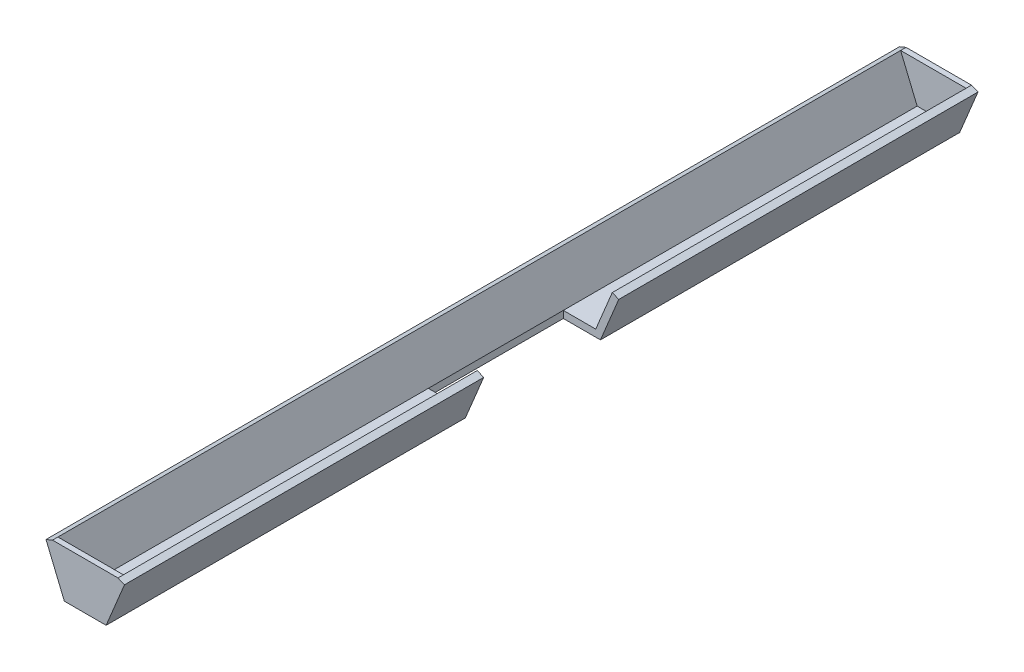
ISO-10303-21;
HEADER;
FILE_DESCRIPTION(('STEP AP214'),'2;1');
FILE_NAME('part.step','',(''),(''),'','','');
FILE_SCHEMA(('AUTOMOTIVE_DESIGN { 1 0 10303 214 1 1 1 1 }'));
ENDSEC;
DATA;
#1=APPLICATION_CONTEXT('core data for automotive mechanical design processes');
#2=APPLICATION_PROTOCOL_DEFINITION('international standard','automotive_design',2000,#1);
#3=PRODUCT_CONTEXT('',#1,'mechanical');
#4=PRODUCT('Part','Part','',(#3));
#5=PRODUCT_RELATED_PRODUCT_CATEGORY('part','',(#4));
#6=PRODUCT_DEFINITION_FORMATION('','',#4);
#7=PRODUCT_DEFINITION_CONTEXT('part definition',#1,'design');
#8=PRODUCT_DEFINITION('design','',#6,#7);
#9=PRODUCT_DEFINITION_SHAPE('','',#8);
#10=(LENGTH_UNIT() NAMED_UNIT(*) SI_UNIT(.MILLI.,.METRE.));
#11=(NAMED_UNIT(*) PLANE_ANGLE_UNIT() SI_UNIT($,.RADIAN.));
#12=(NAMED_UNIT(*) SI_UNIT($,.STERADIAN.) SOLID_ANGLE_UNIT());
#13=UNCERTAINTY_MEASURE_WITH_UNIT(LENGTH_MEASURE(1.E-05),#10,'distance_accuracy_value','');
#14=(GEOMETRIC_REPRESENTATION_CONTEXT(3) GLOBAL_UNCERTAINTY_ASSIGNED_CONTEXT((#13)) GLOBAL_UNIT_ASSIGNED_CONTEXT((#10,
#11,#12)) REPRESENTATION_CONTEXT('',''));
#15=CARTESIAN_POINT('',(0.,0.,0.));
#16=DIRECTION('',(0.,0.,1.));
#17=DIRECTION('',(1.,0.,0.));
#18=AXIS2_PLACEMENT_3D('',#15,#16,#17);
#19=CARTESIAN_POINT('',(3.,0.,79.));
#20=DIRECTION('',(0.923879532511287,-0.38268343236509,0.));
#21=DIRECTION('',(0.38268343236509,0.923879532511287,0.));
#22=AXIS2_PLACEMENT_3D('',#19,#20,#21);
#23=PLANE('',#22);
#24=DIRECTION('',(0.,0.,-1.));
#25=VECTOR('',#24,1.);
#26=CARTESIAN_POINT('',(6.06146745892072,7.39103626009029,79.));
#27=LINE('',#26,#25);
#28=CARTESIAN_POINT('',(6.06146745892072,7.39103626009029,78.));
#29=VERTEX_POINT('',#28);
#30=CARTESIAN_POINT('',(6.06146745892073,7.39103626009029,12.5));
#31=VERTEX_POINT('',#30);
#32=EDGE_CURVE('E253',#29,#31,#27,.T.);
#33=ORIENTED_EDGE('',*,*,#32,.T.);
#34=DIRECTION('',(-0.38268343236509,-0.923879532511287,0.));
#35=VECTOR('',#34,1.);
#36=CARTESIAN_POINT('',(3.,0.,12.5));
#37=LINE('',#36,#35);
#38=CARTESIAN_POINT('',(3.,0.,12.5));
#39=VERTEX_POINT('',#38);
#40=EDGE_CURVE('E185',#31,#39,#37,.T.);
#41=ORIENTED_EDGE('',*,*,#40,.T.);
#42=DIRECTION('',(0.,0.,-1.));
#43=VECTOR('',#42,1.);
#44=CARTESIAN_POINT('',(3.,0.,79.));
#45=LINE('',#44,#43);
#46=CARTESIAN_POINT('',(3.,0.,78.));
#47=VERTEX_POINT('',#46);
#48=EDGE_CURVE('E273',#47,#39,#45,.T.);
#49=ORIENTED_EDGE('',*,*,#48,.F.);
#50=DIRECTION('',(-0.38268343236509,-0.923879532511287,0.));
#51=VECTOR('',#50,1.);
#52=CARTESIAN_POINT('',(3.,0.,78.));
#53=LINE('',#52,#51);
#54=EDGE_CURVE('E201',#29,#47,#53,.T.);
#55=ORIENTED_EDGE('',*,*,#54,.F.);
#56=EDGE_LOOP('',(#33,#41,#49,#55));
#57=FACE_BOUND('',#56,.T.);
#58=ADVANCED_FACE('F33',(#57),#23,.F.);
#59=CARTESIAN_POINT('',(-3.,0.,79.));
#60=DIRECTION('',(0.,-1.,0.));
#61=DIRECTION('',(0.,0.,-1.));
#62=AXIS2_PLACEMENT_3D('',#59,#60,#61);
#63=PLANE('',#62);
#64=ORIENTED_EDGE('',*,*,#48,.T.);
#65=DIRECTION('',(-1.,0.,0.));
#66=VECTOR('',#65,1.);
#67=CARTESIAN_POINT('',(-3.00000000000001,0.,12.5));
#68=LINE('',#67,#66);
#69=CARTESIAN_POINT('',(-3.,0.,12.5));
#70=VERTEX_POINT('',#69);
#71=EDGE_CURVE('E188',#39,#70,#68,.T.);
#72=ORIENTED_EDGE('',*,*,#71,.T.);
#73=DIRECTION('',(0.,0.,-1.));
#74=VECTOR('',#73,1.);
#75=CARTESIAN_POINT('',(-3.,0.,79.));
#76=LINE('',#75,#74);
#77=CARTESIAN_POINT('',(-3.,0.,78.));
#78=VERTEX_POINT('',#77);
#79=EDGE_CURVE('E269',#78,#70,#76,.T.);
#80=ORIENTED_EDGE('',*,*,#79,.F.);
#81=DIRECTION('',(-1.,0.,0.));
#82=VECTOR('',#81,1.);
#83=CARTESIAN_POINT('',(-3.,0.,78.));
#84=LINE('',#83,#82);
#85=EDGE_CURVE('E56',#47,#78,#84,.T.);
#86=ORIENTED_EDGE('',*,*,#85,.F.);
#87=EDGE_LOOP('',(#64,#72,#80,#86));
#88=FACE_BOUND('',#87,.T.);
#89=ADVANCED_FACE('F337',(#88),#63,.F.);
#90=CARTESIAN_POINT('',(3.86863222929509,-1.3,79.));
#91=DIRECTION('',(-0.923879532511286,0.382683432365091,0.));
#92=DIRECTION('',(-0.382683432365091,-0.923879532511286,0.));
#93=AXIS2_PLACEMENT_3D('',#90,#91,#92);
#94=PLANE('',#93);
#95=DIRECTION('',(0.,0.,-1.));
#96=VECTOR('',#95,1.);
#97=CARTESIAN_POINT('',(3.86863222929509,-1.3,79.));
#98=LINE('',#97,#96);
#99=CARTESIAN_POINT('',(3.86863222929509,-1.3,79.));
#100=VERTEX_POINT('',#99);
#101=CARTESIAN_POINT('',(3.86863222929509,-1.3,12.5));
#102=VERTEX_POINT('',#101);
#103=EDGE_CURVE('E258',#100,#102,#98,.T.);
#104=ORIENTED_EDGE('',*,*,#103,.T.);
#105=DIRECTION('',(0.382683432365091,0.923879532511286,0.));
#106=VECTOR('',#105,1.);
#107=CARTESIAN_POINT('',(3.86863222929509,-1.3,12.5));
#108=LINE('',#107,#106);
#109=CARTESIAN_POINT('',(7.2625108511854,6.89354779801567,12.5));
#110=VERTEX_POINT('',#109);
#111=EDGE_CURVE('E166',#102,#110,#108,.T.);
#112=ORIENTED_EDGE('',*,*,#111,.T.);
#113=DIRECTION('',(0.,0.,-1.));
#114=VECTOR('',#113,1.);
#115=CARTESIAN_POINT('',(7.2625108511854,6.89354779801567,79.));
#116=LINE('',#115,#114);
#117=CARTESIAN_POINT('',(7.2625108511854,6.89354779801567,79.));
#118=VERTEX_POINT('',#117);
#119=EDGE_CURVE('E254',#118,#110,#116,.T.);
#120=ORIENTED_EDGE('',*,*,#119,.F.);
#121=DIRECTION('',(0.382683432365091,0.923879532511286,0.));
#122=VECTOR('',#121,1.);
#123=CARTESIAN_POINT('',(3.86863222929509,-1.3,79.));
#124=LINE('',#123,#122);
#125=EDGE_CURVE('E232',#100,#118,#124,.T.);
#126=ORIENTED_EDGE('',*,*,#125,.F.);
#127=EDGE_LOOP('',(#104,#112,#120,#126));
#128=FACE_BOUND('',#127,.T.);
#129=ADVANCED_FACE('F308',(#128),#94,.F.);
#130=CARTESIAN_POINT('',(6.06146745892072,7.39103626009029,79.));
#131=DIRECTION('',(-0.382683432365091,-0.923879532511286,0.));
#132=DIRECTION('',(0.923879532511286,-0.382683432365091,0.));
#133=AXIS2_PLACEMENT_3D('',#130,#131,#132);
#134=PLANE('',#133);
#135=ORIENTED_EDGE('',*,*,#119,.T.);
#136=DIRECTION('',(-0.923879532511286,0.382683432365091,0.));
#137=VECTOR('',#136,1.);
#138=CARTESIAN_POINT('',(6.06146745892072,7.39103626009029,12.5));
#139=LINE('',#138,#137);
#140=EDGE_CURVE('E11',#110,#31,#139,.T.);
#141=ORIENTED_EDGE('',*,*,#140,.T.);
#142=ORIENTED_EDGE('',*,*,#32,.F.);
#143=CARTESIAN_POINT('',(6.06146745892072,7.39103626009029,79.));
#144=VERTEX_POINT('',#143);
#145=EDGE_CURVE('E249',#144,#29,#27,.T.);
#146=ORIENTED_EDGE('',*,*,#145,.F.);
#147=DIRECTION('',(-0.923879532511287,0.382683432365091,0.));
#148=VECTOR('',#147,1.);
#149=CARTESIAN_POINT('',(6.06146745892072,7.39103626009029,79.));
#150=LINE('',#149,#148);
#151=EDGE_CURVE('E234',#118,#144,#150,.T.);
#152=ORIENTED_EDGE('',*,*,#151,.F.);
#153=EDGE_LOOP('',(#135,#141,#142,#146,#152));
#154=FACE_BOUND('',#153,.T.);
#155=ADVANCED_FACE('F304',(#154),#134,.F.);
#156=CARTESIAN_POINT('',(3.,0.,-12.5));
#157=VERTEX_POINT('',#156);
#158=CARTESIAN_POINT('',(3.,0.,-78.));
#159=VERTEX_POINT('',#158);
#160=EDGE_CURVE('E272',#157,#159,#45,.T.);
#161=ORIENTED_EDGE('',*,*,#160,.F.);
#162=DIRECTION('',(0.38268343236509,0.923879532511287,0.));
#163=VECTOR('',#162,1.);
#164=CARTESIAN_POINT('',(3.,0.,-12.5));
#165=LINE('',#164,#163);
#166=CARTESIAN_POINT('',(6.06146745892072,7.39103626009029,-12.5));
#167=VERTEX_POINT('',#166);
#168=EDGE_CURVE('E178',#157,#167,#165,.T.);
#169=ORIENTED_EDGE('',*,*,#168,.T.);
#170=CARTESIAN_POINT('',(6.06146745892072,7.39103626009029,-78.));
#171=VERTEX_POINT('',#170);
#172=EDGE_CURVE('E236',#167,#171,#27,.T.);
#173=ORIENTED_EDGE('',*,*,#172,.T.);
#174=DIRECTION('',(0.38268343236509,0.923879532511287,0.));
#175=VECTOR('',#174,1.);
#176=CARTESIAN_POINT('',(3.,0.,-78.));
#177=LINE('',#176,#175);
#178=EDGE_CURVE('E221',#159,#171,#177,.T.);
#179=ORIENTED_EDGE('',*,*,#178,.F.);
#180=EDGE_LOOP('',(#161,#169,#173,#179));
#181=FACE_BOUND('',#180,.T.);
#182=ADVANCED_FACE('F35',(#181),#23,.F.);
#183=CARTESIAN_POINT('',(-3.,0.,-12.5));
#184=VERTEX_POINT('',#183);
#185=CARTESIAN_POINT('',(-3.,0.,-78.));
#186=VERTEX_POINT('',#185);
#187=EDGE_CURVE('E268',#184,#186,#76,.T.);
#188=ORIENTED_EDGE('',*,*,#187,.F.);
#189=DIRECTION('',(1.,0.,0.));
#190=VECTOR('',#189,1.);
#191=CARTESIAN_POINT('',(-3.,0.,-12.5));
#192=LINE('',#191,#190);
#193=EDGE_CURVE('E181',#184,#157,#192,.T.);
#194=ORIENTED_EDGE('',*,*,#193,.T.);
#195=ORIENTED_EDGE('',*,*,#160,.T.);
#196=DIRECTION('',(1.,0.,0.));
#197=VECTOR('',#196,1.);
#198=CARTESIAN_POINT('',(-3.,0.,-78.));
#199=LINE('',#198,#197);
#200=EDGE_CURVE('E218',#186,#159,#199,.T.);
#201=ORIENTED_EDGE('',*,*,#200,.F.);
#202=EDGE_LOOP('',(#188,#194,#195,#201));
#203=FACE_BOUND('',#202,.T.);
#204=ADVANCED_FACE('F327',(#203),#63,.F.);
#205=CARTESIAN_POINT('',(-3.,0.,79.));
#206=DIRECTION('',(-0.923879532511287,-0.38268343236509,0.));
#207=DIRECTION('',(0.38268343236509,-0.923879532511287,0.));
#208=AXIS2_PLACEMENT_3D('',#205,#206,#207);
#209=PLANE('',#208);
#210=DIRECTION('',(-0.38268343236509,0.923879532511287,0.));
#211=VECTOR('',#210,1.);
#212=CARTESIAN_POINT('',(-3.,0.,78.));
#213=LINE('',#212,#211);
#214=CARTESIAN_POINT('',(-6.06146745892072,7.39103626009029,78.));
#215=VERTEX_POINT('',#214);
#216=EDGE_CURVE('E195',#78,#215,#213,.T.);
#217=ORIENTED_EDGE('',*,*,#216,.F.);
#218=ORIENTED_EDGE('',*,*,#79,.T.);
#219=DIRECTION('',(0.,0.,-1.));
#220=VECTOR('',#219,1.);
#221=CARTESIAN_POINT('',(-3.,0.,79.));
#222=LINE('',#221,#220);
#223=EDGE_CURVE('E156',#70,#184,#222,.T.);
#224=ORIENTED_EDGE('',*,*,#223,.T.);
#225=ORIENTED_EDGE('',*,*,#187,.T.);
#226=DIRECTION('',(0.38268343236509,-0.923879532511287,0.));
#227=VECTOR('',#226,1.);
#228=CARTESIAN_POINT('',(-3.,0.,-78.));
#229=LINE('',#228,#227);
#230=CARTESIAN_POINT('',(-6.06146745892072,7.39103626009029,-78.));
#231=VERTEX_POINT('',#230);
#232=EDGE_CURVE('E214',#231,#186,#229,.T.);
#233=ORIENTED_EDGE('',*,*,#232,.F.);
#234=DIRECTION('',(0.,0.,-1.));
#235=VECTOR('',#234,1.);
#236=CARTESIAN_POINT('',(-6.06146745892072,7.39103626009029,79.));
#237=LINE('',#236,#235);
#238=EDGE_CURVE('E264',#215,#231,#237,.T.);
#239=ORIENTED_EDGE('',*,*,#238,.F.);
#240=EDGE_LOOP('',(#217,#218,#224,#225,#233,#239));
#241=FACE_BOUND('',#240,.T.);
#242=ADVANCED_FACE('F324',(#241),#209,.F.);
#243=CARTESIAN_POINT('',(-6.06146745892072,7.39103626009029,79.));
#244=DIRECTION('',(0.382683432365091,-0.923879532511286,0.));
#245=DIRECTION('',(0.923879532511286,0.382683432365091,0.));
#246=AXIS2_PLACEMENT_3D('',#243,#244,#245);
#247=PLANE('',#246);
#248=CARTESIAN_POINT('',(-6.06146745892072,7.39103626009029,79.));
#249=VERTEX_POINT('',#248);
#250=EDGE_CURVE('E265',#249,#215,#237,.T.);
#251=ORIENTED_EDGE('',*,*,#250,.T.);
#252=ORIENTED_EDGE('',*,*,#238,.T.);
#253=DIRECTION('',(0.,0.,-1.));
#254=VECTOR('',#253,1.);
#255=CARTESIAN_POINT('',(-6.06146745892072,7.39103626009029,-78.));
#256=LINE('',#255,#254);
#257=CARTESIAN_POINT('',(-6.06146745892072,7.39103626009029,-79.));
#258=VERTEX_POINT('',#257);
#259=EDGE_CURVE('E208',#231,#258,#256,.T.);
#260=ORIENTED_EDGE('',*,*,#259,.T.);
#261=DIRECTION('',(-0.923879532511287,-0.382683432365091,0.));
#262=VECTOR('',#261,1.);
#263=CARTESIAN_POINT('',(-6.06146745892072,7.39103626009029,-79.));
#264=LINE('',#263,#262);
#265=CARTESIAN_POINT('',(-7.2625108511854,6.89354779801567,-79.));
#266=VERTEX_POINT('',#265);
#267=EDGE_CURVE('E224',#258,#266,#264,.T.);
#268=ORIENTED_EDGE('',*,*,#267,.T.);
#269=DIRECTION('',(0.,0.,-1.));
#270=VECTOR('',#269,1.);
#271=CARTESIAN_POINT('',(-7.2625108511854,6.89354779801567,79.));
#272=LINE('',#271,#270);
#273=CARTESIAN_POINT('',(-7.2625108511854,6.89354779801567,79.));
#274=VERTEX_POINT('',#273);
#275=EDGE_CURVE('E262',#274,#266,#272,.T.);
#276=ORIENTED_EDGE('',*,*,#275,.F.);
#277=DIRECTION('',(-0.923879532511287,-0.382683432365091,0.));
#278=VECTOR('',#277,1.);
#279=CARTESIAN_POINT('',(-6.06146745892072,7.39103626009029,79.));
#280=LINE('',#279,#278);
#281=EDGE_CURVE('E225',#249,#274,#280,.T.);
#282=ORIENTED_EDGE('',*,*,#281,.F.);
#283=EDGE_LOOP('',(#251,#252,#260,#268,#276,#282));
#284=FACE_BOUND('',#283,.T.);
#285=ADVANCED_FACE('F321',(#284),#247,.F.);
#286=CARTESIAN_POINT('',(-3.86863222929509,-1.3,79.));
#287=DIRECTION('',(0.923879532511286,0.382683432365091,0.));
#288=DIRECTION('',(-0.382683432365091,0.923879532511286,0.));
#289=AXIS2_PLACEMENT_3D('',#286,#287,#288);
#290=PLANE('',#289);
#291=ORIENTED_EDGE('',*,*,#275,.T.);
#292=DIRECTION('',(0.382683432365091,-0.923879532511286,0.));
#293=VECTOR('',#292,1.);
#294=CARTESIAN_POINT('',(-3.86863222929509,-1.3,-79.));
#295=LINE('',#294,#293);
#296=CARTESIAN_POINT('',(-3.86863222929509,-1.3,-79.));
#297=VERTEX_POINT('',#296);
#298=EDGE_CURVE('E239',#266,#297,#295,.T.);
#299=ORIENTED_EDGE('',*,*,#298,.T.);
#300=DIRECTION('',(0.,0.,-1.));
#301=VECTOR('',#300,1.);
#302=CARTESIAN_POINT('',(-3.86863222929509,-1.3,79.));
#303=LINE('',#302,#301);
#304=CARTESIAN_POINT('',(-3.86863222929509,-1.3,79.));
#305=VERTEX_POINT('',#304);
#306=EDGE_CURVE('E260',#305,#297,#303,.T.);
#307=ORIENTED_EDGE('',*,*,#306,.F.);
#308=DIRECTION('',(0.382683432365091,-0.923879532511286,0.));
#309=VECTOR('',#308,1.);
#310=CARTESIAN_POINT('',(-3.86863222929509,-1.3,79.));
#311=LINE('',#310,#309);
#312=EDGE_CURVE('E227',#274,#305,#311,.T.);
#313=ORIENTED_EDGE('',*,*,#312,.F.);
#314=EDGE_LOOP('',(#291,#299,#307,#313));
#315=FACE_BOUND('',#314,.T.);
#316=ADVANCED_FACE('F318',(#315),#290,.F.);
#317=CARTESIAN_POINT('',(-3.86863222929509,-1.3,79.));
#318=DIRECTION('',(0.,1.,0.));
#319=DIRECTION('',(0.,0.,1.));
#320=AXIS2_PLACEMENT_3D('',#317,#318,#319);
#321=PLANE('',#320);
#322=DIRECTION('',(0.,0.,-1.));
#323=VECTOR('',#322,1.);
#324=CARTESIAN_POINT('',(-3.,-1.3,12.5));
#325=LINE('',#324,#323);
#326=CARTESIAN_POINT('',(-3.,-1.3,12.5));
#327=VERTEX_POINT('',#326);
#328=CARTESIAN_POINT('',(-3.,-1.3,-12.5));
#329=VERTEX_POINT('',#328);
#330=EDGE_CURVE('E153',#327,#329,#325,.T.);
#331=ORIENTED_EDGE('',*,*,#330,.F.);
#332=DIRECTION('',(-1.,0.,0.));
#333=VECTOR('',#332,1.);
#334=CARTESIAN_POINT('',(20.9721246339143,-1.3,12.5));
#335=LINE('',#334,#333);
#336=EDGE_CURVE('E163',#102,#327,#335,.T.);
#337=ORIENTED_EDGE('',*,*,#336,.F.);
#338=ORIENTED_EDGE('',*,*,#103,.F.);
#339=DIRECTION('',(1.,0.,0.));
#340=VECTOR('',#339,1.);
#341=CARTESIAN_POINT('',(-3.86863222929509,-1.3,79.));
#342=LINE('',#341,#340);
#343=EDGE_CURVE('E230',#305,#100,#342,.T.);
#344=ORIENTED_EDGE('',*,*,#343,.F.);
#345=ORIENTED_EDGE('',*,*,#306,.T.);
#346=DIRECTION('',(1.,0.,0.));
#347=VECTOR('',#346,1.);
#348=CARTESIAN_POINT('',(-3.86863222929509,-1.3,-79.));
#349=LINE('',#348,#347);
#350=CARTESIAN_POINT('',(3.86863222929509,-1.3,-79.));
#351=VERTEX_POINT('',#350);
#352=EDGE_CURVE('E242',#297,#351,#349,.T.);
#353=ORIENTED_EDGE('',*,*,#352,.T.);
#354=CARTESIAN_POINT('',(3.86863222929509,-1.3,-12.5));
#355=VERTEX_POINT('',#354);
#356=EDGE_CURVE('E257',#355,#351,#98,.T.);
#357=ORIENTED_EDGE('',*,*,#356,.F.);
#358=DIRECTION('',(1.,0.,0.));
#359=VECTOR('',#358,1.);
#360=CARTESIAN_POINT('',(-3.,-1.3,-12.5));
#361=LINE('',#360,#359);
#362=EDGE_CURVE('E160',#329,#355,#361,.T.);
#363=ORIENTED_EDGE('',*,*,#362,.F.);
#364=EDGE_LOOP('',(#331,#337,#338,#344,#345,#353,#357,#363));
#365=FACE_BOUND('',#364,.T.);
#366=ADVANCED_FACE('F171',(#365),#321,.F.);
#367=CARTESIAN_POINT('',(7.2625108511854,6.89354779801567,-12.5));
#368=VERTEX_POINT('',#367);
#369=CARTESIAN_POINT('',(7.2625108511854,6.89354779801567,-79.));
#370=VERTEX_POINT('',#369);
#371=EDGE_CURVE('E252',#368,#370,#116,.T.);
#372=ORIENTED_EDGE('',*,*,#371,.F.);
#373=DIRECTION('',(-0.382683432365091,-0.923879532511286,0.));
#374=VECTOR('',#373,1.);
#375=CARTESIAN_POINT('',(3.86863222929509,-1.3,-12.5));
#376=LINE('',#375,#374);
#377=EDGE_CURVE('E48',#368,#355,#376,.T.);
#378=ORIENTED_EDGE('',*,*,#377,.T.);
#379=ORIENTED_EDGE('',*,*,#356,.T.);
#380=DIRECTION('',(0.382683432365091,0.923879532511286,0.));
#381=VECTOR('',#380,1.);
#382=CARTESIAN_POINT('',(3.86863222929509,-1.3,-79.));
#383=LINE('',#382,#381);
#384=EDGE_CURVE('E245',#351,#370,#383,.T.);
#385=ORIENTED_EDGE('',*,*,#384,.T.);
#386=EDGE_LOOP('',(#372,#378,#379,#385));
#387=FACE_BOUND('',#386,.T.);
#388=ADVANCED_FACE('F280',(#387),#94,.F.);
#389=ORIENTED_EDGE('',*,*,#172,.F.);
#390=DIRECTION('',(0.923879532511286,-0.382683432365091,0.));
#391=VECTOR('',#390,1.);
#392=CARTESIAN_POINT('',(6.06146745892072,7.39103626009029,-12.5));
#393=LINE('',#392,#391);
#394=EDGE_CURVE('E41',#167,#368,#393,.T.);
#395=ORIENTED_EDGE('',*,*,#394,.T.);
#396=ORIENTED_EDGE('',*,*,#371,.T.);
#397=DIRECTION('',(-0.923879532511287,0.382683432365091,0.));
#398=VECTOR('',#397,1.);
#399=CARTESIAN_POINT('',(6.06146745892072,7.39103626009029,-79.));
#400=LINE('',#399,#398);
#401=CARTESIAN_POINT('',(6.06146745892072,7.39103626009029,-79.));
#402=VERTEX_POINT('',#401);
#403=EDGE_CURVE('E228',#370,#402,#400,.T.);
#404=ORIENTED_EDGE('',*,*,#403,.T.);
#405=DIRECTION('',(0.,0.,-1.));
#406=VECTOR('',#405,1.);
#407=CARTESIAN_POINT('',(6.06146745892072,7.39103626009029,-78.));
#408=LINE('',#407,#406);
#409=EDGE_CURVE('E211',#171,#402,#408,.T.);
#410=ORIENTED_EDGE('',*,*,#409,.F.);
#411=EDGE_LOOP('',(#389,#395,#396,#404,#410));
#412=FACE_BOUND('',#411,.T.);
#413=ADVANCED_FACE('F277',(#412),#134,.F.);
#414=CARTESIAN_POINT('',(0.,0.,79.));
#415=DIRECTION('',(0.,0.,-1.));
#416=DIRECTION('',(-1.,0.,0.));
#417=AXIS2_PLACEMENT_3D('',#414,#415,#416);
#418=PLANE('',#417);
#419=ORIENTED_EDGE('',*,*,#151,.T.);
#420=DIRECTION('',(1.,0.,0.));
#421=VECTOR('',#420,1.);
#422=CARTESIAN_POINT('',(6.06146745892072,7.39103626009029,79.));
#423=LINE('',#422,#421);
#424=EDGE_CURVE('E191',#249,#144,#423,.T.);
#425=ORIENTED_EDGE('',*,*,#424,.F.);
#426=ORIENTED_EDGE('',*,*,#281,.T.);
#427=ORIENTED_EDGE('',*,*,#312,.T.);
#428=ORIENTED_EDGE('',*,*,#343,.T.);
#429=ORIENTED_EDGE('',*,*,#125,.T.);
#430=EDGE_LOOP('',(#419,#425,#426,#427,#428,#429));
#431=FACE_BOUND('',#430,.T.);
#432=ADVANCED_FACE('F313',(#431),#418,.F.);
#433=CARTESIAN_POINT('',(0.,0.,-79.));
#434=DIRECTION('',(0.,0.,-1.));
#435=DIRECTION('',(-1.,0.,0.));
#436=AXIS2_PLACEMENT_3D('',#433,#434,#435);
#437=PLANE('',#436);
#438=DIRECTION('',(1.,0.,0.));
#439=VECTOR('',#438,1.);
#440=CARTESIAN_POINT('',(6.06146745892072,7.39103626009029,-79.));
#441=LINE('',#440,#439);
#442=EDGE_CURVE('E204',#258,#402,#441,.T.);
#443=ORIENTED_EDGE('',*,*,#442,.T.);
#444=ORIENTED_EDGE('',*,*,#403,.F.);
#445=ORIENTED_EDGE('',*,*,#384,.F.);
#446=ORIENTED_EDGE('',*,*,#352,.F.);
#447=ORIENTED_EDGE('',*,*,#298,.F.);
#448=ORIENTED_EDGE('',*,*,#267,.F.);
#449=EDGE_LOOP('',(#443,#444,#445,#446,#447,#448));
#450=FACE_BOUND('',#449,.T.);
#451=ADVANCED_FACE('F285',(#450),#437,.T.);
#452=CARTESIAN_POINT('',(0.,0.,-78.));
#453=DIRECTION('',(0.,0.,-1.));
#454=DIRECTION('',(-1.,0.,0.));
#455=AXIS2_PLACEMENT_3D('',#452,#453,#454);
#456=PLANE('',#455);
#457=ORIENTED_EDGE('',*,*,#200,.T.);
#458=ORIENTED_EDGE('',*,*,#178,.T.);
#459=DIRECTION('',(1.,0.,0.));
#460=VECTOR('',#459,1.);
#461=CARTESIAN_POINT('',(6.06146745892072,7.39103626009029,-78.));
#462=LINE('',#461,#460);
#463=EDGE_CURVE('E205',#231,#171,#462,.T.);
#464=ORIENTED_EDGE('',*,*,#463,.F.);
#465=ORIENTED_EDGE('',*,*,#232,.T.);
#466=EDGE_LOOP('',(#457,#458,#464,#465));
#467=FACE_BOUND('',#466,.T.);
#468=ADVANCED_FACE('F293',(#467),#456,.F.);
#469=CARTESIAN_POINT('',(6.06146745892072,7.39103626009029,-78.));
#470=DIRECTION('',(0.,1.,0.));
#471=DIRECTION('',(0.,0.,1.));
#472=AXIS2_PLACEMENT_3D('',#469,#470,#471);
#473=PLANE('',#472);
#474=ORIENTED_EDGE('',*,*,#442,.F.);
#475=ORIENTED_EDGE('',*,*,#259,.F.);
#476=ORIENTED_EDGE('',*,*,#463,.T.);
#477=ORIENTED_EDGE('',*,*,#409,.T.);
#478=EDGE_LOOP('',(#474,#475,#476,#477));
#479=FACE_BOUND('',#478,.T.);
#480=ADVANCED_FACE('F289',(#479),#473,.T.);
#481=CARTESIAN_POINT('',(0.,0.,78.));
#482=DIRECTION('',(0.,0.,1.));
#483=DIRECTION('',(-1.,0.,0.));
#484=AXIS2_PLACEMENT_3D('',#481,#482,#483);
#485=PLANE('',#484);
#486=DIRECTION('',(1.,0.,0.));
#487=VECTOR('',#486,1.);
#488=CARTESIAN_POINT('',(6.06146745892072,7.39103626009029,78.));
#489=LINE('',#488,#487);
#490=EDGE_CURVE('E192',#215,#29,#489,.T.);
#491=ORIENTED_EDGE('',*,*,#490,.T.);
#492=ORIENTED_EDGE('',*,*,#54,.T.);
#493=ORIENTED_EDGE('',*,*,#85,.T.);
#494=ORIENTED_EDGE('',*,*,#216,.T.);
#495=EDGE_LOOP('',(#491,#492,#493,#494));
#496=FACE_BOUND('',#495,.T.);
#497=ADVANCED_FACE('F422',(#496),#485,.F.);
#498=CARTESIAN_POINT('',(6.06146745892072,7.39103626009029,78.));
#499=DIRECTION('',(0.,-1.,0.));
#500=DIRECTION('',(0.,0.,-1.));
#501=AXIS2_PLACEMENT_3D('',#498,#499,#500);
#502=PLANE('',#501);
#503=ORIENTED_EDGE('',*,*,#424,.T.);
#504=ORIENTED_EDGE('',*,*,#145,.T.);
#505=ORIENTED_EDGE('',*,*,#490,.F.);
#506=ORIENTED_EDGE('',*,*,#250,.F.);
#507=EDGE_LOOP('',(#503,#504,#505,#506));
#508=FACE_BOUND('',#507,.T.);
#509=ADVANCED_FACE('F404',(#508),#502,.F.);
#510=CARTESIAN_POINT('',(-3.,7.39103626009029,12.5));
#511=DIRECTION('',(-1.,0.,0.));
#512=DIRECTION('',(0.,0.,1.));
#513=AXIS2_PLACEMENT_3D('',#510,#511,#512);
#514=PLANE('',#513);
#515=DIRECTION('',(0.,-1.,0.));
#516=VECTOR('',#515,1.);
#517=CARTESIAN_POINT('',(-3.,7.39103626009029,12.5));
#518=LINE('',#517,#516);
#519=EDGE_CURVE('E148',#70,#327,#518,.T.);
#520=ORIENTED_EDGE('',*,*,#519,.T.);
#521=ORIENTED_EDGE('',*,*,#330,.T.);
#522=DIRECTION('',(0.,-1.,0.));
#523=VECTOR('',#522,1.);
#524=CARTESIAN_POINT('',(-3.,7.39103626009029,-12.5));
#525=LINE('',#524,#523);
#526=EDGE_CURVE('E159',#184,#329,#525,.T.);
#527=ORIENTED_EDGE('',*,*,#526,.F.);
#528=ORIENTED_EDGE('',*,*,#223,.F.);
#529=EDGE_LOOP('',(#520,#521,#527,#528));
#530=FACE_BOUND('',#529,.T.);
#531=ADVANCED_FACE('F150',(#530),#514,.F.);
#532=CARTESIAN_POINT('',(20.9721246339143,7.39103626009029,12.5));
#533=DIRECTION('',(0.,0.,1.));
#534=DIRECTION('',(1.,0.,0.));
#535=AXIS2_PLACEMENT_3D('',#532,#533,#534);
#536=PLANE('',#535);
#537=ORIENTED_EDGE('',*,*,#40,.F.);
#538=ORIENTED_EDGE('',*,*,#140,.F.);
#539=ORIENTED_EDGE('',*,*,#111,.F.);
#540=ORIENTED_EDGE('',*,*,#336,.T.);
#541=ORIENTED_EDGE('',*,*,#519,.F.);
#542=ORIENTED_EDGE('',*,*,#71,.F.);
#543=EDGE_LOOP('',(#537,#538,#539,#540,#541,#542));
#544=FACE_BOUND('',#543,.T.);
#545=ADVANCED_FACE('F164',(#544),#536,.F.);
#546=CARTESIAN_POINT('',(-3.,7.39103626009029,-12.5));
#547=DIRECTION('',(0.,0.,-1.));
#548=DIRECTION('',(-1.,0.,0.));
#549=AXIS2_PLACEMENT_3D('',#546,#547,#548);
#550=PLANE('',#549);
#551=ORIENTED_EDGE('',*,*,#526,.T.);
#552=ORIENTED_EDGE('',*,*,#362,.T.);
#553=ORIENTED_EDGE('',*,*,#377,.F.);
#554=ORIENTED_EDGE('',*,*,#394,.F.);
#555=ORIENTED_EDGE('',*,*,#168,.F.);
#556=ORIENTED_EDGE('',*,*,#193,.F.);
#557=EDGE_LOOP('',(#551,#552,#553,#554,#555,#556));
#558=FACE_BOUND('',#557,.T.);
#559=ADVANCED_FACE('F328',(#558),#550,.F.);
#560=CLOSED_SHELL('',(#58,#89,#129,#155,#182,#204,#242,#285,#316,#366,#388,#413,#432,#451,#468,
#480,#497,#509,#531,#545,#559));
#561=MANIFOLD_SOLID_BREP('B2',#560);
#562=ADVANCED_BREP_SHAPE_REPRESENTATION('',(#18,#561),#14);
#563=SHAPE_DEFINITION_REPRESENTATION(#9,#562);
ENDSEC;
END-ISO-10303-21;
